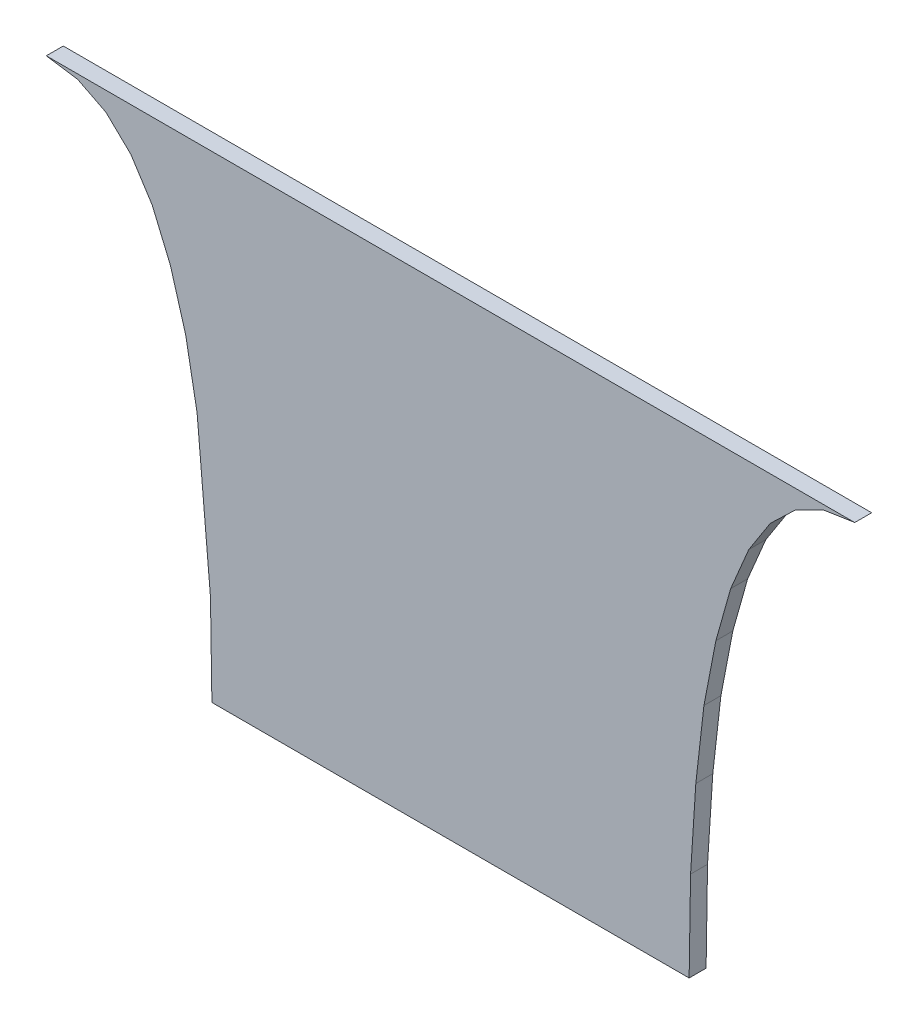
ISO-10303-21;
HEADER;
FILE_DESCRIPTION(('STEP AP214'),'2;1');
FILE_NAME('part.step','',(''),(''),'','','');
FILE_SCHEMA(('AUTOMOTIVE_DESIGN { 1 0 10303 214 1 1 1 1 }'));
ENDSEC;
DATA;
#1=APPLICATION_CONTEXT('core data for automotive mechanical design processes');
#2=APPLICATION_PROTOCOL_DEFINITION('international standard','automotive_design',2000,#1);
#3=PRODUCT_CONTEXT('',#1,'mechanical');
#4=PRODUCT('Part','Part','',(#3));
#5=PRODUCT_RELATED_PRODUCT_CATEGORY('part','',(#4));
#6=PRODUCT_DEFINITION_FORMATION('','',#4);
#7=PRODUCT_DEFINITION_CONTEXT('part definition',#1,'design');
#8=PRODUCT_DEFINITION('design','',#6,#7);
#9=PRODUCT_DEFINITION_SHAPE('','',#8);
#10=(LENGTH_UNIT() NAMED_UNIT(*) SI_UNIT(.MILLI.,.METRE.));
#11=(NAMED_UNIT(*) PLANE_ANGLE_UNIT() SI_UNIT($,.RADIAN.));
#12=(NAMED_UNIT(*) SI_UNIT($,.STERADIAN.) SOLID_ANGLE_UNIT());
#13=UNCERTAINTY_MEASURE_WITH_UNIT(LENGTH_MEASURE(1.E-05),#10,'distance_accuracy_value','');
#14=(GEOMETRIC_REPRESENTATION_CONTEXT(3) GLOBAL_UNCERTAINTY_ASSIGNED_CONTEXT((#13)) GLOBAL_UNIT_ASSIGNED_CONTEXT((#10,
#11,#12)) REPRESENTATION_CONTEXT('',''));
#15=CARTESIAN_POINT('',(0.,0.,0.));
#16=DIRECTION('',(0.,0.,1.));
#17=DIRECTION('',(1.,0.,0.));
#18=AXIS2_PLACEMENT_3D('',#15,#16,#17);
#19=CARTESIAN_POINT('',(78.5899963378906,104.962997436523,0.));
#20=DIRECTION('',(-0.999874875396206,0.0158187721211896,0.));
#21=DIRECTION('',(0.0158187721211896,0.999874875396206,0.));
#22=AXIS2_PLACEMENT_3D('',#19,#20,#21);
#23=PLANE('',#22);
#24=DIRECTION('',(0.0158187721211896,0.999874875396206,0.));
#25=VECTOR('',#24,1.);
#26=CARTESIAN_POINT('',(78.5899963378906,104.962997436523,0.03556));
#27=LINE('',#26,#25);
#28=CARTESIAN_POINT('',(78.5899963378906,104.962997436523,0.03556));
#29=VERTEX_POINT('',#28);
#30=CARTESIAN_POINT('',(78.5930023193359,105.15299987793,0.03556));
#31=VERTEX_POINT('',#30);
#32=EDGE_CURVE('E11',#29,#31,#27,.T.);
#33=ORIENTED_EDGE('',*,*,#32,.F.);
#34=DIRECTION('',(0.,0.,1.));
#35=VECTOR('',#34,1.);
#36=CARTESIAN_POINT('',(78.5899963378906,104.962997436523,0.));
#37=LINE('',#36,#35);
#38=CARTESIAN_POINT('',(78.5899963378906,104.962997436523,0.));
#39=VERTEX_POINT('',#38);
#40=EDGE_CURVE('E24',#39,#29,#37,.T.);
#41=ORIENTED_EDGE('',*,*,#40,.F.);
#42=DIRECTION('',(0.0158187721211896,0.999874875396206,0.));
#43=VECTOR('',#42,1.);
#44=CARTESIAN_POINT('',(78.5899963378906,104.962997436523,0.));
#45=LINE('',#44,#43);
#46=CARTESIAN_POINT('',(78.5930023193359,105.15299987793,0.));
#47=VERTEX_POINT('',#46);
#48=EDGE_CURVE('E178',#39,#47,#45,.T.);
#49=ORIENTED_EDGE('',*,*,#48,.T.);
#50=DIRECTION('',(0.,0.,1.));
#51=VECTOR('',#50,1.);
#52=CARTESIAN_POINT('',(78.5930023193359,105.15299987793,0.));
#53=LINE('',#52,#51);
#54=EDGE_CURVE('E37',#47,#31,#53,.T.);
#55=ORIENTED_EDGE('',*,*,#54,.T.);
#56=EDGE_LOOP('',(#33,#41,#49,#55));
#57=FACE_BOUND('',#56,.T.);
#58=ADVANCED_FACE('F17',(#57),#23,.F.);
#59=CARTESIAN_POINT('',(78.5930023193359,105.15299987793,0.));
#60=DIRECTION('',(-0.997915365339674,0.0645362194351706,0.));
#61=DIRECTION('',(0.0645362194351706,0.997915365339674,0.));
#62=AXIS2_PLACEMENT_3D('',#59,#60,#61);
#63=PLANE('',#62);
#64=DIRECTION('',(0.0645362194351706,0.997915365339674,0.));
#65=VECTOR('',#64,1.);
#66=CARTESIAN_POINT('',(78.5930023193359,105.15299987793,0.03556));
#67=LINE('',#66,#65);
#68=CARTESIAN_POINT('',(78.6039962768555,105.322998046875,0.03556));
#69=VERTEX_POINT('',#68);
#70=EDGE_CURVE('E322',#31,#69,#67,.T.);
#71=ORIENTED_EDGE('',*,*,#70,.F.);
#72=ORIENTED_EDGE('',*,*,#54,.F.);
#73=DIRECTION('',(0.0645362194351706,0.997915365339674,0.));
#74=VECTOR('',#73,1.);
#75=CARTESIAN_POINT('',(78.5930023193359,105.15299987793,0.));
#76=LINE('',#75,#74);
#77=CARTESIAN_POINT('',(78.6039962768555,105.322998046875,0.));
#78=VERTEX_POINT('',#77);
#79=EDGE_CURVE('E319',#47,#78,#76,.T.);
#80=ORIENTED_EDGE('',*,*,#79,.T.);
#81=DIRECTION('',(0.,0.,1.));
#82=VECTOR('',#81,1.);
#83=CARTESIAN_POINT('',(78.6039962768555,105.322998046875,0.));
#84=LINE('',#83,#82);
#85=EDGE_CURVE('E317',#78,#69,#84,.T.);
#86=ORIENTED_EDGE('',*,*,#85,.T.);
#87=EDGE_LOOP('',(#71,#72,#80,#86));
#88=FACE_BOUND('',#87,.T.);
#89=ADVANCED_FACE('F330',(#88),#63,.F.);
#90=CARTESIAN_POINT('',(78.6039962768555,105.322998046875,0.));
#91=DIRECTION('',(-0.993634729487296,0.112650008241045,0.));
#92=DIRECTION('',(0.112650008241045,0.993634729487296,0.));
#93=AXIS2_PLACEMENT_3D('',#90,#91,#92);
#94=PLANE('',#93);
#95=DIRECTION('',(0.112650008241045,0.993634729487296,0.));
#96=VECTOR('',#95,1.);
#97=CARTESIAN_POINT('',(78.6039962768555,105.322998046875,0.03556));
#98=LINE('',#97,#96);
#99=CARTESIAN_POINT('',(78.6210021972656,105.472999572754,0.03556));
#100=VERTEX_POINT('',#99);
#101=EDGE_CURVE('E314',#69,#100,#98,.T.);
#102=ORIENTED_EDGE('',*,*,#101,.F.);
#103=ORIENTED_EDGE('',*,*,#85,.F.);
#104=DIRECTION('',(0.112650008241045,0.993634729487296,0.));
#105=VECTOR('',#104,1.);
#106=CARTESIAN_POINT('',(78.6039962768555,105.322998046875,0.));
#107=LINE('',#106,#105);
#108=CARTESIAN_POINT('',(78.6210021972656,105.472999572754,0.));
#109=VERTEX_POINT('',#108);
#110=EDGE_CURVE('E311',#78,#109,#107,.T.);
#111=ORIENTED_EDGE('',*,*,#110,.T.);
#112=DIRECTION('',(0.,0.,1.));
#113=VECTOR('',#112,1.);
#114=CARTESIAN_POINT('',(78.6210021972656,105.472999572754,0.));
#115=LINE('',#114,#113);
#116=EDGE_CURVE('E309',#109,#100,#115,.T.);
#117=ORIENTED_EDGE('',*,*,#116,.T.);
#118=EDGE_LOOP('',(#102,#103,#111,#117));
#119=FACE_BOUND('',#118,.T.);
#120=ADVANCED_FACE('F336',(#119),#94,.F.);
#121=CARTESIAN_POINT('',(78.6210021972656,105.472999572754,0.));
#122=DIRECTION('',(-0.982003569342415,0.188862356754217,0.));
#123=DIRECTION('',(0.188862356754217,0.982003569342415,0.));
#124=AXIS2_PLACEMENT_3D('',#121,#122,#123);
#125=PLANE('',#124);
#126=DIRECTION('',(0.188862356754217,0.982003569342415,0.));
#127=VECTOR('',#126,1.);
#128=CARTESIAN_POINT('',(78.6210021972656,105.472999572754,0.03556));
#129=LINE('',#128,#127);
#130=CARTESIAN_POINT('',(78.6460037231445,105.602996826172,0.03556));
#131=VERTEX_POINT('',#130);
#132=EDGE_CURVE('E306',#100,#131,#129,.T.);
#133=ORIENTED_EDGE('',*,*,#132,.F.);
#134=ORIENTED_EDGE('',*,*,#116,.F.);
#135=DIRECTION('',(0.188862356754217,0.982003569342415,0.));
#136=VECTOR('',#135,1.);
#137=CARTESIAN_POINT('',(78.6210021972656,105.472999572754,0.));
#138=LINE('',#137,#136);
#139=CARTESIAN_POINT('',(78.6460037231445,105.602996826172,0.));
#140=VERTEX_POINT('',#139);
#141=EDGE_CURVE('E303',#109,#140,#138,.T.);
#142=ORIENTED_EDGE('',*,*,#141,.T.);
#143=DIRECTION('',(0.,0.,1.));
#144=VECTOR('',#143,1.);
#145=CARTESIAN_POINT('',(78.6460037231445,105.602996826172,0.));
#146=LINE('',#145,#144);
#147=EDGE_CURVE('E301',#140,#131,#146,.T.);
#148=ORIENTED_EDGE('',*,*,#147,.T.);
#149=EDGE_LOOP('',(#133,#134,#142,#148));
#150=FACE_BOUND('',#149,.T.);
#151=ADVANCED_FACE('F338',(#150),#125,.F.);
#152=CARTESIAN_POINT('',(78.6460037231445,105.602996826172,0.));
#153=DIRECTION('',(-0.962512708005787,0.271236588474651,0.));
#154=DIRECTION('',(0.271236588474651,0.962512708005787,0.));
#155=AXIS2_PLACEMENT_3D('',#152,#153,#154);
#156=PLANE('',#155);
#157=DIRECTION('',(0.271236588474651,0.962512708005787,0.));
#158=VECTOR('',#157,1.);
#159=CARTESIAN_POINT('',(78.6460037231445,105.602996826172,0.03556));
#160=LINE('',#159,#158);
#161=CARTESIAN_POINT('',(78.677001953125,105.712997436523,0.03556));
#162=VERTEX_POINT('',#161);
#163=EDGE_CURVE('E298',#131,#162,#160,.T.);
#164=ORIENTED_EDGE('',*,*,#163,.F.);
#165=ORIENTED_EDGE('',*,*,#147,.F.);
#166=DIRECTION('',(0.271236588474651,0.962512708005787,0.));
#167=VECTOR('',#166,1.);
#168=CARTESIAN_POINT('',(78.6460037231445,105.602996826172,0.));
#169=LINE('',#168,#167);
#170=CARTESIAN_POINT('',(78.677001953125,105.712997436523,0.));
#171=VERTEX_POINT('',#170);
#172=EDGE_CURVE('E295',#140,#171,#169,.T.);
#173=ORIENTED_EDGE('',*,*,#172,.T.);
#174=DIRECTION('',(0.,0.,1.));
#175=VECTOR('',#174,1.);
#176=CARTESIAN_POINT('',(78.677001953125,105.712997436523,0.));
#177=LINE('',#176,#175);
#178=EDGE_CURVE('E293',#171,#162,#177,.T.);
#179=ORIENTED_EDGE('',*,*,#178,.T.);
#180=EDGE_LOOP('',(#164,#165,#173,#179));
#181=FACE_BOUND('',#180,.T.);
#182=ADVANCED_FACE('F343',(#181),#156,.F.);
#183=CARTESIAN_POINT('',(78.677001953125,105.712997436523,0.));
#184=DIRECTION('',(-0.921276299759863,0.388908703297798,0.));
#185=DIRECTION('',(0.388908703297798,0.921276299759863,0.));
#186=AXIS2_PLACEMENT_3D('',#183,#184,#185);
#187=PLANE('',#186);
#188=DIRECTION('',(0.388908703297798,0.921276299759863,0.));
#189=VECTOR('',#188,1.);
#190=CARTESIAN_POINT('',(78.677001953125,105.712997436523,0.03556));
#191=LINE('',#190,#189);
#192=CARTESIAN_POINT('',(78.7149963378906,105.803001403809,0.03556));
#193=VERTEX_POINT('',#192);
#194=EDGE_CURVE('E290',#162,#193,#191,.T.);
#195=ORIENTED_EDGE('',*,*,#194,.F.);
#196=ORIENTED_EDGE('',*,*,#178,.F.);
#197=DIRECTION('',(0.388908703297798,0.921276299759863,0.));
#198=VECTOR('',#197,1.);
#199=CARTESIAN_POINT('',(78.677001953125,105.712997436523,0.));
#200=LINE('',#199,#198);
#201=CARTESIAN_POINT('',(78.7149963378906,105.803001403809,0.));
#202=VERTEX_POINT('',#201);
#203=EDGE_CURVE('E287',#171,#202,#200,.T.);
#204=ORIENTED_EDGE('',*,*,#203,.T.);
#205=DIRECTION('',(0.,0.,1.));
#206=VECTOR('',#205,1.);
#207=CARTESIAN_POINT('',(78.7149963378906,105.803001403809,0.));
#208=LINE('',#207,#206);
#209=EDGE_CURVE('E285',#202,#193,#208,.T.);
#210=ORIENTED_EDGE('',*,*,#209,.T.);
#211=EDGE_LOOP('',(#195,#196,#204,#210));
#212=FACE_BOUND('',#211,.T.);
#213=ADVANCED_FACE('F346',(#212),#187,.F.);
#214=CARTESIAN_POINT('',(78.7149963378906,105.803001403809,0.));
#215=DIRECTION('',(-0.841145708046733,0.540808559320728,0.));
#216=DIRECTION('',(0.540808559320728,0.841145708046733,0.));
#217=AXIS2_PLACEMENT_3D('',#214,#215,#216);
#218=PLANE('',#217);
#219=DIRECTION('',(0.540808559320728,0.841145708046733,0.));
#220=VECTOR('',#219,1.);
#221=CARTESIAN_POINT('',(78.7149963378906,105.803001403809,0.03556));
#222=LINE('',#221,#220);
#223=CARTESIAN_POINT('',(78.7600021362305,105.873001098633,0.03556));
#224=VERTEX_POINT('',#223);
#225=EDGE_CURVE('E282',#193,#224,#222,.T.);
#226=ORIENTED_EDGE('',*,*,#225,.F.);
#227=ORIENTED_EDGE('',*,*,#209,.F.);
#228=DIRECTION('',(0.540808559320728,0.841145708046733,0.));
#229=VECTOR('',#228,1.);
#230=CARTESIAN_POINT('',(78.7149963378906,105.803001403809,0.));
#231=LINE('',#230,#229);
#232=CARTESIAN_POINT('',(78.7600021362305,105.873001098633,0.));
#233=VERTEX_POINT('',#232);
#234=EDGE_CURVE('E279',#202,#233,#231,.T.);
#235=ORIENTED_EDGE('',*,*,#234,.T.);
#236=DIRECTION('',(0.,0.,1.));
#237=VECTOR('',#236,1.);
#238=CARTESIAN_POINT('',(78.7600021362305,105.873001098633,0.));
#239=LINE('',#238,#237);
#240=EDGE_CURVE('E277',#233,#224,#239,.T.);
#241=ORIENTED_EDGE('',*,*,#240,.T.);
#242=EDGE_LOOP('',(#226,#227,#235,#241));
#243=FACE_BOUND('',#242,.T.);
#244=ADVANCED_FACE('F351',(#243),#218,.F.);
#245=CARTESIAN_POINT('',(78.7600021362305,105.873001098633,0.));
#246=DIRECTION('',(-0.693115057585885,0.720826967411538,0.));
#247=DIRECTION('',(0.720826967411538,0.693115057585885,0.));
#248=AXIS2_PLACEMENT_3D('',#245,#246,#247);
#249=PLANE('',#248);
#250=DIRECTION('',(0.720826967411538,0.693115057585885,0.));
#251=VECTOR('',#250,1.);
#252=CARTESIAN_POINT('',(78.7600021362305,105.873001098633,0.03556));
#253=LINE('',#252,#251);
#254=CARTESIAN_POINT('',(78.8119964599609,105.922996520996,0.03556));
#255=VERTEX_POINT('',#254);
#256=EDGE_CURVE('E274',#224,#255,#253,.T.);
#257=ORIENTED_EDGE('',*,*,#256,.F.);
#258=ORIENTED_EDGE('',*,*,#240,.F.);
#259=DIRECTION('',(0.720826967411538,0.693115057585885,0.));
#260=VECTOR('',#259,1.);
#261=CARTESIAN_POINT('',(78.7600021362305,105.873001098633,0.));
#262=LINE('',#261,#260);
#263=CARTESIAN_POINT('',(78.8119964599609,105.922996520996,0.));
#264=VERTEX_POINT('',#263);
#265=EDGE_CURVE('E271',#233,#264,#262,.T.);
#266=ORIENTED_EDGE('',*,*,#265,.T.);
#267=DIRECTION('',(0.,0.,1.));
#268=VECTOR('',#267,1.);
#269=CARTESIAN_POINT('',(78.8119964599609,105.922996520996,0.));
#270=LINE('',#269,#268);
#271=EDGE_CURVE('E269',#264,#255,#270,.T.);
#272=ORIENTED_EDGE('',*,*,#271,.T.);
#273=EDGE_LOOP('',(#257,#258,#266,#272));
#274=FACE_BOUND('',#273,.T.);
#275=ADVANCED_FACE('F354',(#274),#249,.F.);
#276=CARTESIAN_POINT('',(78.8119964599609,105.922996520996,0.));
#277=DIRECTION('',(-0.453288583530174,0.89136382024469,0.));
#278=DIRECTION('',(0.89136382024469,0.453288583530174,0.));
#279=AXIS2_PLACEMENT_3D('',#276,#277,#278);
#280=PLANE('',#279);
#281=DIRECTION('',(0.89136382024469,0.453288583530174,0.));
#282=VECTOR('',#281,1.);
#283=CARTESIAN_POINT('',(78.8119964599609,105.922996520996,0.03556));
#284=LINE('',#283,#282);
#285=CARTESIAN_POINT('',(78.8710021972656,105.953002929688,0.03556));
#286=VERTEX_POINT('',#285);
#287=EDGE_CURVE('E266',#255,#286,#284,.T.);
#288=ORIENTED_EDGE('',*,*,#287,.F.);
#289=ORIENTED_EDGE('',*,*,#271,.F.);
#290=DIRECTION('',(0.89136382024469,0.453288583530174,0.));
#291=VECTOR('',#290,1.);
#292=CARTESIAN_POINT('',(78.8119964599609,105.922996520996,0.));
#293=LINE('',#292,#291);
#294=CARTESIAN_POINT('',(78.8710021972656,105.953002929688,0.));
#295=VERTEX_POINT('',#294);
#296=EDGE_CURVE('E263',#264,#295,#293,.T.);
#297=ORIENTED_EDGE('',*,*,#296,.T.);
#298=DIRECTION('',(0.,0.,1.));
#299=VECTOR('',#298,1.);
#300=CARTESIAN_POINT('',(78.8710021972656,105.953002929688,0.));
#301=LINE('',#300,#299);
#302=EDGE_CURVE('E261',#295,#286,#301,.T.);
#303=ORIENTED_EDGE('',*,*,#302,.T.);
#304=EDGE_LOOP('',(#288,#289,#297,#303));
#305=FACE_BOUND('',#304,.T.);
#306=ADVANCED_FACE('F359',(#305),#280,.F.);
#307=CARTESIAN_POINT('',(78.8710021972656,105.953002929688,0.));
#308=DIRECTION('',(-0.149737658836747,0.988725762547983,0.));
#309=DIRECTION('',(0.988725762547983,0.149737658836747,0.));
#310=AXIS2_PLACEMENT_3D('',#307,#308,#309);
#311=PLANE('',#310);
#312=DIRECTION('',(0.988725762547983,0.149737658836747,0.));
#313=VECTOR('',#312,1.);
#314=CARTESIAN_POINT('',(78.8710021972656,105.953002929688,0.03556));
#315=LINE('',#314,#313);
#316=CARTESIAN_POINT('',(78.9369964599609,105.962997436523,0.03556));
#317=VERTEX_POINT('',#316);
#318=EDGE_CURVE('E258',#286,#317,#315,.T.);
#319=ORIENTED_EDGE('',*,*,#318,.F.);
#320=ORIENTED_EDGE('',*,*,#302,.F.);
#321=DIRECTION('',(0.988725762547983,0.149737658836747,0.));
#322=VECTOR('',#321,1.);
#323=CARTESIAN_POINT('',(78.8710021972656,105.953002929688,0.));
#324=LINE('',#323,#322);
#325=CARTESIAN_POINT('',(78.9369964599609,105.962997436523,0.));
#326=VERTEX_POINT('',#325);
#327=EDGE_CURVE('E255',#295,#326,#324,.T.);
#328=ORIENTED_EDGE('',*,*,#327,.T.);
#329=DIRECTION('',(0.,0.,1.));
#330=VECTOR('',#329,1.);
#331=CARTESIAN_POINT('',(78.9369964599609,105.962997436523,0.));
#332=LINE('',#331,#330);
#333=EDGE_CURVE('E253',#326,#317,#332,.T.);
#334=ORIENTED_EDGE('',*,*,#333,.T.);
#335=EDGE_LOOP('',(#319,#320,#328,#334));
#336=FACE_BOUND('',#335,.T.);
#337=ADVANCED_FACE('F362',(#336),#311,.F.);
#338=CARTESIAN_POINT('',(78.9369964599609,105.962997436523,0.));
#339=DIRECTION('',(0.,-1.,0.));
#340=DIRECTION('',(-1.,0.,0.));
#341=AXIS2_PLACEMENT_3D('',#338,#339,#340);
#342=PLANE('',#341);
#343=DIRECTION('',(-1.,0.,0.));
#344=VECTOR('',#343,1.);
#345=CARTESIAN_POINT('',(78.9369964599609,105.962997436523,0.03556));
#346=LINE('',#345,#344);
#347=CARTESIAN_POINT('',(77.2429962158203,105.962997436523,0.03556));
#348=VERTEX_POINT('',#347);
#349=EDGE_CURVE('E250',#317,#348,#346,.T.);
#350=ORIENTED_EDGE('',*,*,#349,.F.);
#351=ORIENTED_EDGE('',*,*,#333,.F.);
#352=DIRECTION('',(-1.,0.,0.));
#353=VECTOR('',#352,1.);
#354=CARTESIAN_POINT('',(78.9369964599609,105.962997436523,0.));
#355=LINE('',#354,#353);
#356=CARTESIAN_POINT('',(77.2429962158203,105.962997436523,0.));
#357=VERTEX_POINT('',#356);
#358=EDGE_CURVE('E247',#326,#357,#355,.T.);
#359=ORIENTED_EDGE('',*,*,#358,.T.);
#360=DIRECTION('',(0.,0.,1.));
#361=VECTOR('',#360,1.);
#362=CARTESIAN_POINT('',(77.2429962158203,105.962997436523,0.));
#363=LINE('',#362,#361);
#364=EDGE_CURVE('E245',#357,#348,#363,.T.);
#365=ORIENTED_EDGE('',*,*,#364,.T.);
#366=EDGE_LOOP('',(#350,#351,#359,#365));
#367=FACE_BOUND('',#366,.T.);
#368=ADVANCED_FACE('F367',(#367),#342,.F.);
#369=CARTESIAN_POINT('',(77.2429962158203,105.962997436523,0.));
#370=DIRECTION('',(0.149720738144923,0.988728324955516,0.));
#371=DIRECTION('',(0.988728324955516,-0.149720738144923,0.));
#372=AXIS2_PLACEMENT_3D('',#369,#370,#371);
#373=PLANE('',#372);
#374=DIRECTION('',(0.988728324955516,-0.149720738144923,0.));
#375=VECTOR('',#374,1.);
#376=CARTESIAN_POINT('',(77.2429962158203,105.962997436523,0.03556));
#377=LINE('',#376,#375);
#378=CARTESIAN_POINT('',(77.3089981079102,105.953002929688,0.03556));
#379=VERTEX_POINT('',#378);
#380=EDGE_CURVE('E242',#348,#379,#377,.T.);
#381=ORIENTED_EDGE('',*,*,#380,.F.);
#382=ORIENTED_EDGE('',*,*,#364,.F.);
#383=DIRECTION('',(0.988728324955516,-0.149720738144923,0.));
#384=VECTOR('',#383,1.);
#385=CARTESIAN_POINT('',(77.2429962158203,105.962997436523,0.));
#386=LINE('',#385,#384);
#387=CARTESIAN_POINT('',(77.3089981079102,105.953002929688,0.));
#388=VERTEX_POINT('',#387);
#389=EDGE_CURVE('E239',#357,#388,#386,.T.);
#390=ORIENTED_EDGE('',*,*,#389,.T.);
#391=DIRECTION('',(0.,0.,1.));
#392=VECTOR('',#391,1.);
#393=CARTESIAN_POINT('',(77.3089981079102,105.953002929688,0.));
#394=LINE('',#393,#392);
#395=EDGE_CURVE('E237',#388,#379,#394,.T.);
#396=ORIENTED_EDGE('',*,*,#395,.T.);
#397=EDGE_LOOP('',(#381,#382,#390,#396));
#398=FACE_BOUND('',#397,.T.);
#399=ADVANCED_FACE('F370',(#398),#373,.F.);
#400=CARTESIAN_POINT('',(77.3089981079102,105.953002929688,0.));
#401=DIRECTION('',(0.453335154948689,0.891340135575442,0.));
#402=DIRECTION('',(0.891340135575442,-0.453335154948689,0.));
#403=AXIS2_PLACEMENT_3D('',#400,#401,#402);
#404=PLANE('',#403);
#405=DIRECTION('',(0.891340135575442,-0.453335154948689,0.));
#406=VECTOR('',#405,1.);
#407=CARTESIAN_POINT('',(77.3089981079102,105.953002929688,0.03556));
#408=LINE('',#407,#406);
#409=CARTESIAN_POINT('',(77.3679962158203,105.922996520996,0.03556));
#410=VERTEX_POINT('',#409);
#411=EDGE_CURVE('E234',#379,#410,#408,.T.);
#412=ORIENTED_EDGE('',*,*,#411,.F.);
#413=ORIENTED_EDGE('',*,*,#395,.F.);
#414=DIRECTION('',(0.891340135575442,-0.453335154948689,0.));
#415=VECTOR('',#414,1.);
#416=CARTESIAN_POINT('',(77.3089981079102,105.953002929688,0.));
#417=LINE('',#416,#415);
#418=CARTESIAN_POINT('',(77.3679962158203,105.922996520996,0.));
#419=VERTEX_POINT('',#418);
#420=EDGE_CURVE('E231',#388,#419,#417,.T.);
#421=ORIENTED_EDGE('',*,*,#420,.T.);
#422=DIRECTION('',(0.,0.,1.));
#423=VECTOR('',#422,1.);
#424=CARTESIAN_POINT('',(77.3679962158203,105.922996520996,0.));
#425=LINE('',#424,#423);
#426=EDGE_CURVE('E229',#419,#410,#425,.T.);
#427=ORIENTED_EDGE('',*,*,#426,.T.);
#428=EDGE_LOOP('',(#412,#413,#421,#427));
#429=FACE_BOUND('',#428,.T.);
#430=ADVANCED_FACE('F375',(#429),#404,.F.);
#431=CARTESIAN_POINT('',(77.3679962158203,105.922996520996,0.));
#432=DIRECTION('',(0.69306221504161,0.720877774717474,0.));
#433=DIRECTION('',(0.720877774717474,-0.69306221504161,0.));
#434=AXIS2_PLACEMENT_3D('',#431,#432,#433);
#435=PLANE('',#434);
#436=DIRECTION('',(0.720877774717474,-0.693062215041609,0.));
#437=VECTOR('',#436,1.);
#438=CARTESIAN_POINT('',(77.3679962158203,105.922996520996,0.03556));
#439=LINE('',#438,#437);
#440=CARTESIAN_POINT('',(77.4199981689453,105.873001098633,0.03556));
#441=VERTEX_POINT('',#440);
#442=EDGE_CURVE('E226',#410,#441,#439,.T.);
#443=ORIENTED_EDGE('',*,*,#442,.F.);
#444=ORIENTED_EDGE('',*,*,#426,.F.);
#445=DIRECTION('',(0.720877774717474,-0.693062215041609,0.));
#446=VECTOR('',#445,1.);
#447=CARTESIAN_POINT('',(77.3679962158203,105.922996520996,0.));
#448=LINE('',#447,#446);
#449=CARTESIAN_POINT('',(77.4199981689453,105.873001098633,0.));
#450=VERTEX_POINT('',#449);
#451=EDGE_CURVE('E223',#419,#450,#448,.T.);
#452=ORIENTED_EDGE('',*,*,#451,.T.);
#453=DIRECTION('',(0.,0.,1.));
#454=VECTOR('',#453,1.);
#455=CARTESIAN_POINT('',(77.4199981689453,105.873001098633,0.));
#456=LINE('',#455,#454);
#457=EDGE_CURVE('E221',#450,#441,#456,.T.);
#458=ORIENTED_EDGE('',*,*,#457,.T.);
#459=EDGE_LOOP('',(#443,#444,#452,#458));
#460=FACE_BOUND('',#459,.T.);
#461=ADVANCED_FACE('F378',(#460),#435,.F.);
#462=CARTESIAN_POINT('',(77.4199981689453,105.873001098633,0.));
#463=DIRECTION('',(0.841187411828098,0.540743689914128,0.));
#464=DIRECTION('',(0.540743689914128,-0.841187411828098,0.));
#465=AXIS2_PLACEMENT_3D('',#462,#463,#464);
#466=PLANE('',#465);
#467=DIRECTION('',(0.540743689914128,-0.841187411828098,0.));
#468=VECTOR('',#467,1.);
#469=CARTESIAN_POINT('',(77.4199981689453,105.873001098633,0.03556));
#470=LINE('',#469,#468);
#471=CARTESIAN_POINT('',(77.4649963378906,105.803001403809,0.03556));
#472=VERTEX_POINT('',#471);
#473=EDGE_CURVE('E218',#441,#472,#470,.T.);
#474=ORIENTED_EDGE('',*,*,#473,.F.);
#475=ORIENTED_EDGE('',*,*,#457,.F.);
#476=DIRECTION('',(0.540743689914128,-0.841187411828098,0.));
#477=VECTOR('',#476,1.);
#478=CARTESIAN_POINT('',(77.4199981689453,105.873001098633,0.));
#479=LINE('',#478,#477);
#480=CARTESIAN_POINT('',(77.4649963378906,105.803001403809,0.));
#481=VERTEX_POINT('',#480);
#482=EDGE_CURVE('E215',#450,#481,#479,.T.);
#483=ORIENTED_EDGE('',*,*,#482,.T.);
#484=DIRECTION('',(0.,0.,1.));
#485=VECTOR('',#484,1.);
#486=CARTESIAN_POINT('',(77.4649963378906,105.803001403809,0.));
#487=LINE('',#486,#485);
#488=EDGE_CURVE('E213',#481,#472,#487,.T.);
#489=ORIENTED_EDGE('',*,*,#488,.T.);
#490=EDGE_LOOP('',(#474,#475,#483,#489));
#491=FACE_BOUND('',#490,.T.);
#492=ADVANCED_FACE('F383',(#491),#466,.F.);
#493=CARTESIAN_POINT('',(77.4649963378906,105.803001403809,0.));
#494=DIRECTION('',(0.921248317699084,0.388974982661621,0.));
#495=DIRECTION('',(0.388974982661621,-0.921248317699084,0.));
#496=AXIS2_PLACEMENT_3D('',#493,#494,#495);
#497=PLANE('',#496);
#498=DIRECTION('',(0.388974982661621,-0.921248317699084,0.));
#499=VECTOR('',#498,1.);
#500=CARTESIAN_POINT('',(77.4649963378906,105.803001403809,0.03556));
#501=LINE('',#500,#499);
#502=CARTESIAN_POINT('',(77.5029983520508,105.712997436523,0.03556));
#503=VERTEX_POINT('',#502);
#504=EDGE_CURVE('E210',#472,#503,#501,.T.);
#505=ORIENTED_EDGE('',*,*,#504,.F.);
#506=ORIENTED_EDGE('',*,*,#488,.F.);
#507=DIRECTION('',(0.388974982661621,-0.921248317699084,0.));
#508=VECTOR('',#507,1.);
#509=CARTESIAN_POINT('',(77.4649963378906,105.803001403809,0.));
#510=LINE('',#509,#508);
#511=CARTESIAN_POINT('',(77.5029983520508,105.712997436523,0.));
#512=VERTEX_POINT('',#511);
#513=EDGE_CURVE('E207',#481,#512,#510,.T.);
#514=ORIENTED_EDGE('',*,*,#513,.T.);
#515=DIRECTION('',(0.,0.,1.));
#516=VECTOR('',#515,1.);
#517=CARTESIAN_POINT('',(77.5029983520508,105.712997436523,0.));
#518=LINE('',#517,#516);
#519=EDGE_CURVE('E205',#512,#503,#518,.T.);
#520=ORIENTED_EDGE('',*,*,#519,.T.);
#521=EDGE_LOOP('',(#505,#506,#514,#520));
#522=FACE_BOUND('',#521,.T.);
#523=ADVANCED_FACE('F386',(#522),#497,.F.);
#524=CARTESIAN_POINT('',(77.5029983520508,105.712997436523,0.));
#525=DIRECTION('',(0.960183279585808,0.279370846016262,0.));
#526=DIRECTION('',(0.279370846016262,-0.960183279585808,0.));
#527=AXIS2_PLACEMENT_3D('',#524,#525,#526);
#528=PLANE('',#527);
#529=DIRECTION('',(0.279370846016262,-0.960183279585808,0.));
#530=VECTOR('',#529,1.);
#531=CARTESIAN_POINT('',(77.5029983520508,105.712997436523,0.03556));
#532=LINE('',#531,#530);
#533=CARTESIAN_POINT('',(77.5350036621094,105.602996826172,0.03556));
#534=VERTEX_POINT('',#533);
#535=EDGE_CURVE('E202',#503,#534,#532,.T.);
#536=ORIENTED_EDGE('',*,*,#535,.F.);
#537=ORIENTED_EDGE('',*,*,#519,.F.);
#538=DIRECTION('',(0.279370846016262,-0.960183279585808,0.));
#539=VECTOR('',#538,1.);
#540=CARTESIAN_POINT('',(77.5029983520508,105.712997436523,0.));
#541=LINE('',#540,#539);
#542=CARTESIAN_POINT('',(77.5350036621094,105.602996826172,0.));
#543=VERTEX_POINT('',#542);
#544=EDGE_CURVE('E199',#512,#543,#541,.T.);
#545=ORIENTED_EDGE('',*,*,#544,.T.);
#546=DIRECTION('',(0.,0.,1.));
#547=VECTOR('',#546,1.);
#548=CARTESIAN_POINT('',(77.5350036621094,105.602996826172,0.));
#549=LINE('',#548,#547);
#550=EDGE_CURVE('E197',#543,#534,#549,.T.);
#551=ORIENTED_EDGE('',*,*,#550,.T.);
#552=EDGE_LOOP('',(#536,#537,#545,#551));
#553=FACE_BOUND('',#552,.T.);
#554=ADVANCED_FACE('F391',(#553),#528,.F.);
#555=CARTESIAN_POINT('',(77.5350036621094,105.602996826172,0.));
#556=DIRECTION('',(0.983388995997273,0.181510557685981,0.));
#557=DIRECTION('',(0.181510557685981,-0.983388995997273,0.));
#558=AXIS2_PLACEMENT_3D('',#555,#556,#557);
#559=PLANE('',#558);
#560=DIRECTION('',(0.181510557685981,-0.983388995997273,0.));
#561=VECTOR('',#560,1.);
#562=CARTESIAN_POINT('',(77.5350036621094,105.602996826172,0.03556));
#563=LINE('',#562,#561);
#564=CARTESIAN_POINT('',(77.5589981079102,105.472999572754,0.03556));
#565=VERTEX_POINT('',#564);
#566=EDGE_CURVE('E194',#534,#565,#563,.T.);
#567=ORIENTED_EDGE('',*,*,#566,.F.);
#568=ORIENTED_EDGE('',*,*,#550,.F.);
#569=DIRECTION('',(0.181510557685981,-0.983388995997273,0.));
#570=VECTOR('',#569,1.);
#571=CARTESIAN_POINT('',(77.5350036621094,105.602996826172,0.));
#572=LINE('',#571,#570);
#573=CARTESIAN_POINT('',(77.5589981079102,105.472999572754,0.));
#574=VERTEX_POINT('',#573);
#575=EDGE_CURVE('E191',#543,#574,#572,.T.);
#576=ORIENTED_EDGE('',*,*,#575,.T.);
#577=DIRECTION('',(0.,0.,1.));
#578=VECTOR('',#577,1.);
#579=CARTESIAN_POINT('',(77.5589981079102,105.472999572754,0.));
#580=LINE('',#579,#578);
#581=EDGE_CURVE('E189',#574,#565,#580,.T.);
#582=ORIENTED_EDGE('',*,*,#581,.T.);
#583=EDGE_LOOP('',(#567,#568,#576,#582));
#584=FACE_BOUND('',#583,.T.);
#585=ADVANCED_FACE('F394',(#584),#559,.F.);
#586=CARTESIAN_POINT('',(77.5589981079102,105.472999572754,0.));
#587=DIRECTION('',(0.996193743276489,0.0871666556475387,0.));
#588=DIRECTION('',(0.0871666556475387,-0.996193743276489,0.));
#589=AXIS2_PLACEMENT_3D('',#586,#587,#588);
#590=PLANE('',#589);
#591=DIRECTION('',(0.0871666556475387,-0.996193743276489,0.));
#592=VECTOR('',#591,1.);
#593=CARTESIAN_POINT('',(77.5589981079102,105.472999572754,0.03556));
#594=LINE('',#593,#592);
#595=CARTESIAN_POINT('',(77.5869979858398,105.15299987793,0.03556));
#596=VERTEX_POINT('',#595);
#597=EDGE_CURVE('E186',#565,#596,#594,.T.);
#598=ORIENTED_EDGE('',*,*,#597,.F.);
#599=ORIENTED_EDGE('',*,*,#581,.F.);
#600=DIRECTION('',(0.0871666556475387,-0.996193743276489,0.));
#601=VECTOR('',#600,1.);
#602=CARTESIAN_POINT('',(77.5589981079102,105.472999572754,0.));
#603=LINE('',#602,#601);
#604=CARTESIAN_POINT('',(77.5869979858398,105.15299987793,0.));
#605=VERTEX_POINT('',#604);
#606=EDGE_CURVE('E184',#574,#605,#603,.T.);
#607=ORIENTED_EDGE('',*,*,#606,.T.);
#608=DIRECTION('',(0.,0.,1.));
#609=VECTOR('',#608,1.);
#610=CARTESIAN_POINT('',(77.5869979858398,105.15299987793,0.));
#611=LINE('',#610,#609);
#612=EDGE_CURVE('E169',#605,#596,#611,.T.);
#613=ORIENTED_EDGE('',*,*,#612,.T.);
#614=EDGE_LOOP('',(#598,#599,#607,#613));
#615=FACE_BOUND('',#614,.T.);
#616=ADVANCED_FACE('F397',(#615),#590,.F.);
#617=CARTESIAN_POINT('',(77.5869979858398,105.15299987793,0.));
#618=DIRECTION('',(0.999875509622001,0.0157786329618313,0.));
#619=DIRECTION('',(0.0157786329618313,-0.999875509622001,0.));
#620=AXIS2_PLACEMENT_3D('',#617,#618,#619);
#621=PLANE('',#620);
#622=DIRECTION('',(0.0157786329618313,-0.999875509622001,0.));
#623=VECTOR('',#622,1.);
#624=CARTESIAN_POINT('',(77.5869979858398,105.15299987793,0.03556));
#625=LINE('',#624,#623);
#626=CARTESIAN_POINT('',(77.5899963378906,104.962997436523,0.03556));
#627=VERTEX_POINT('',#626);
#628=EDGE_CURVE('E173',#596,#627,#625,.T.);
#629=ORIENTED_EDGE('',*,*,#628,.F.);
#630=ORIENTED_EDGE('',*,*,#612,.F.);
#631=DIRECTION('',(0.0157786329618313,-0.999875509622001,0.));
#632=VECTOR('',#631,1.);
#633=CARTESIAN_POINT('',(77.5869979858398,105.15299987793,0.));
#634=LINE('',#633,#632);
#635=CARTESIAN_POINT('',(77.5899963378906,104.962997436523,0.));
#636=VERTEX_POINT('',#635);
#637=EDGE_CURVE('E165',#605,#636,#634,.T.);
#638=ORIENTED_EDGE('',*,*,#637,.T.);
#639=DIRECTION('',(0.,0.,1.));
#640=VECTOR('',#639,1.);
#641=CARTESIAN_POINT('',(77.5899963378906,104.962997436523,0.));
#642=LINE('',#641,#640);
#643=EDGE_CURVE('E155',#636,#627,#642,.T.);
#644=ORIENTED_EDGE('',*,*,#643,.T.);
#645=EDGE_LOOP('',(#629,#630,#638,#644));
#646=FACE_BOUND('',#645,.T.);
#647=ADVANCED_FACE('F168',(#646),#621,.F.);
#648=CARTESIAN_POINT('',(77.5899963378906,104.962997436523,0.));
#649=DIRECTION('',(0.,1.,0.));
#650=DIRECTION('',(1.,0.,0.));
#651=AXIS2_PLACEMENT_3D('',#648,#649,#650);
#652=PLANE('',#651);
#653=DIRECTION('',(1.,0.,0.));
#654=VECTOR('',#653,1.);
#655=CARTESIAN_POINT('',(77.5899963378906,104.962997436523,0.03556));
#656=LINE('',#655,#654);
#657=EDGE_CURVE('E161',#627,#29,#656,.T.);
#658=ORIENTED_EDGE('',*,*,#657,.F.);
#659=ORIENTED_EDGE('',*,*,#643,.F.);
#660=DIRECTION('',(1.,0.,0.));
#661=VECTOR('',#660,1.);
#662=CARTESIAN_POINT('',(77.5899963378906,104.962997436523,0.));
#663=LINE('',#662,#661);
#664=EDGE_CURVE('E159',#636,#39,#663,.T.);
#665=ORIENTED_EDGE('',*,*,#664,.T.);
#666=ORIENTED_EDGE('',*,*,#40,.T.);
#667=EDGE_LOOP('',(#658,#659,#665,#666));
#668=FACE_BOUND('',#667,.T.);
#669=ADVANCED_FACE('F157',(#668),#652,.F.);
#670=CARTESIAN_POINT('',(78.5899963378906,104.962997436523,0.));
#671=DIRECTION('',(0.,0.,1.));
#672=DIRECTION('',(1.,0.,0.));
#673=AXIS2_PLACEMENT_3D('',#670,#671,#672);
#674=PLANE('',#673);
#675=ORIENTED_EDGE('',*,*,#664,.F.);
#676=ORIENTED_EDGE('',*,*,#637,.F.);
#677=ORIENTED_EDGE('',*,*,#606,.F.);
#678=ORIENTED_EDGE('',*,*,#575,.F.);
#679=ORIENTED_EDGE('',*,*,#544,.F.);
#680=ORIENTED_EDGE('',*,*,#513,.F.);
#681=ORIENTED_EDGE('',*,*,#482,.F.);
#682=ORIENTED_EDGE('',*,*,#451,.F.);
#683=ORIENTED_EDGE('',*,*,#420,.F.);
#684=ORIENTED_EDGE('',*,*,#389,.F.);
#685=ORIENTED_EDGE('',*,*,#358,.F.);
#686=ORIENTED_EDGE('',*,*,#327,.F.);
#687=ORIENTED_EDGE('',*,*,#296,.F.);
#688=ORIENTED_EDGE('',*,*,#265,.F.);
#689=ORIENTED_EDGE('',*,*,#234,.F.);
#690=ORIENTED_EDGE('',*,*,#203,.F.);
#691=ORIENTED_EDGE('',*,*,#172,.F.);
#692=ORIENTED_EDGE('',*,*,#141,.F.);
#693=ORIENTED_EDGE('',*,*,#110,.F.);
#694=ORIENTED_EDGE('',*,*,#79,.F.);
#695=ORIENTED_EDGE('',*,*,#48,.F.);
#696=EDGE_LOOP('',(#675,#676,#677,#678,#679,#680,#681,#682,#683,#684,#685,#686,#687,#688,#689,
#690,#691,#692,#693,#694,#695));
#697=FACE_BOUND('',#696,.T.);
#698=ADVANCED_FACE('F176',(#697),#674,.F.);
#699=CARTESIAN_POINT('',(78.5899963378906,104.962997436523,0.03556));
#700=DIRECTION('',(0.,0.,1.));
#701=DIRECTION('',(1.,0.,0.));
#702=AXIS2_PLACEMENT_3D('',#699,#700,#701);
#703=PLANE('',#702);
#704=ORIENTED_EDGE('',*,*,#32,.T.);
#705=ORIENTED_EDGE('',*,*,#70,.T.);
#706=ORIENTED_EDGE('',*,*,#101,.T.);
#707=ORIENTED_EDGE('',*,*,#132,.T.);
#708=ORIENTED_EDGE('',*,*,#163,.T.);
#709=ORIENTED_EDGE('',*,*,#194,.T.);
#710=ORIENTED_EDGE('',*,*,#225,.T.);
#711=ORIENTED_EDGE('',*,*,#256,.T.);
#712=ORIENTED_EDGE('',*,*,#287,.T.);
#713=ORIENTED_EDGE('',*,*,#318,.T.);
#714=ORIENTED_EDGE('',*,*,#349,.T.);
#715=ORIENTED_EDGE('',*,*,#380,.T.);
#716=ORIENTED_EDGE('',*,*,#411,.T.);
#717=ORIENTED_EDGE('',*,*,#442,.T.);
#718=ORIENTED_EDGE('',*,*,#473,.T.);
#719=ORIENTED_EDGE('',*,*,#504,.T.);
#720=ORIENTED_EDGE('',*,*,#535,.T.);
#721=ORIENTED_EDGE('',*,*,#566,.T.);
#722=ORIENTED_EDGE('',*,*,#597,.T.);
#723=ORIENTED_EDGE('',*,*,#628,.T.);
#724=ORIENTED_EDGE('',*,*,#657,.T.);
#725=EDGE_LOOP('',(#704,#705,#706,#707,#708,#709,#710,#711,#712,#713,#714,#715,#716,#717,#718,
#719,#720,#721,#722,#723,#724));
#726=FACE_BOUND('',#725,.T.);
#727=ADVANCED_FACE('F333',(#726),#703,.T.);
#728=CLOSED_SHELL('',(#58,#89,#120,#151,#182,#213,#244,#275,#306,#337,#368,#399,#430,#461,#492,
#523,#554,#585,#616,#647,#669,#698,#727));
#729=MANIFOLD_SOLID_BREP('B1',#728);
#730=ADVANCED_BREP_SHAPE_REPRESENTATION('',(#18,#729),#14);
#731=SHAPE_DEFINITION_REPRESENTATION(#9,#730);
ENDSEC;
END-ISO-10303-21;
